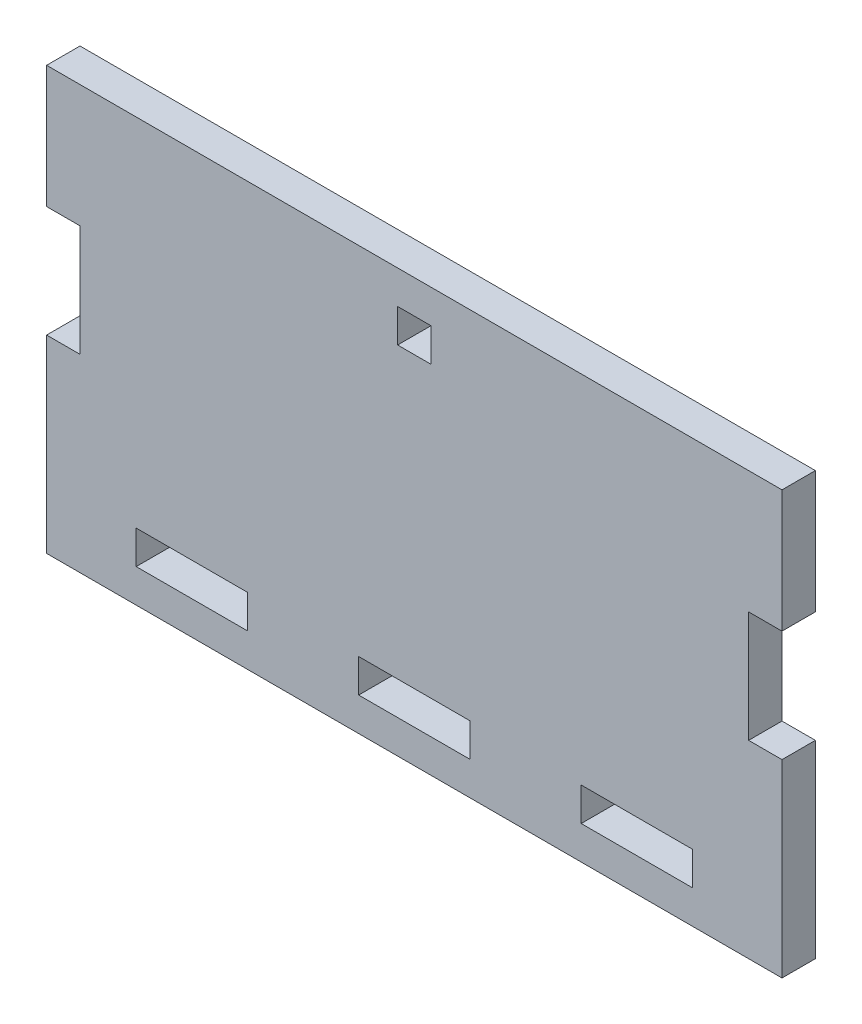
ISO-10303-21;
HEADER;
FILE_DESCRIPTION(('STEP AP214'),'2;1');
FILE_NAME('part.step','',(''),(''),'','','');
FILE_SCHEMA(('AUTOMOTIVE_DESIGN { 1 0 10303 214 1 1 1 1 }'));
ENDSEC;
DATA;
#1=APPLICATION_CONTEXT('core data for automotive mechanical design processes');
#2=APPLICATION_PROTOCOL_DEFINITION('international standard','automotive_design',2000,#1);
#3=PRODUCT_CONTEXT('',#1,'mechanical');
#4=PRODUCT('Part','Part','',(#3));
#5=PRODUCT_RELATED_PRODUCT_CATEGORY('part','',(#4));
#6=PRODUCT_DEFINITION_FORMATION('','',#4);
#7=PRODUCT_DEFINITION_CONTEXT('part definition',#1,'design');
#8=PRODUCT_DEFINITION('design','',#6,#7);
#9=PRODUCT_DEFINITION_SHAPE('','',#8);
#10=(LENGTH_UNIT() NAMED_UNIT(*) SI_UNIT(.MILLI.,.METRE.));
#11=(NAMED_UNIT(*) PLANE_ANGLE_UNIT() SI_UNIT($,.RADIAN.));
#12=(NAMED_UNIT(*) SI_UNIT($,.STERADIAN.) SOLID_ANGLE_UNIT());
#13=UNCERTAINTY_MEASURE_WITH_UNIT(LENGTH_MEASURE(1.E-05),#10,'distance_accuracy_value','');
#14=(GEOMETRIC_REPRESENTATION_CONTEXT(3) GLOBAL_UNCERTAINTY_ASSIGNED_CONTEXT((#13)) GLOBAL_UNIT_ASSIGNED_CONTEXT((#10,
#11,#12)) REPRESENTATION_CONTEXT('',''));
#15=CARTESIAN_POINT('',(0.,0.,0.));
#16=DIRECTION('',(0.,0.,1.));
#17=DIRECTION('',(1.,0.,0.));
#18=AXIS2_PLACEMENT_3D('',#15,#16,#17);
#19=CARTESIAN_POINT('',(-13.0561098857442,0.,3.));
#20=DIRECTION('',(1.,0.,0.));
#21=DIRECTION('',(0.,0.,-1.));
#22=AXIS2_PLACEMENT_3D('',#19,#20,#21);
#23=PLANE('',#22);
#24=DIRECTION('',(0.,-1.,0.));
#25=VECTOR('',#24,1.);
#26=CARTESIAN_POINT('',(-13.0561098857442,0.,0.));
#27=LINE('',#26,#25);
#28=CARTESIAN_POINT('',(-13.0561098857442,-7.19066330459412,0.));
#29=VERTEX_POINT('',#28);
#30=CARTESIAN_POINT('',(-13.0561098857442,-10.1906633045941,0.));
#31=VERTEX_POINT('',#30);
#32=EDGE_CURVE('E318',#29,#31,#27,.T.);
#33=ORIENTED_EDGE('',*,*,#32,.F.);
#34=DIRECTION('',(0.,0.,-1.));
#35=VECTOR('',#34,1.);
#36=CARTESIAN_POINT('',(-13.0561098857442,-7.19066330459412,3.));
#37=LINE('',#36,#35);
#38=CARTESIAN_POINT('',(-13.0561098857442,-7.19066330459412,3.));
#39=VERTEX_POINT('',#38);
#40=EDGE_CURVE('E11',#39,#29,#37,.T.);
#41=ORIENTED_EDGE('',*,*,#40,.F.);
#42=DIRECTION('',(0.,-1.,0.));
#43=VECTOR('',#42,1.);
#44=CARTESIAN_POINT('',(-13.0561098857442,0.,3.));
#45=LINE('',#44,#43);
#46=CARTESIAN_POINT('',(-13.0561098857442,-10.1906633045941,3.));
#47=VERTEX_POINT('',#46);
#48=EDGE_CURVE('E247',#39,#47,#45,.T.);
#49=ORIENTED_EDGE('',*,*,#48,.T.);
#50=DIRECTION('',(0.,0.,-1.));
#51=VECTOR('',#50,1.);
#52=CARTESIAN_POINT('',(-13.0561098857442,-10.1906633045941,3.));
#53=LINE('',#52,#51);
#54=EDGE_CURVE('E148',#47,#31,#53,.T.);
#55=ORIENTED_EDGE('',*,*,#54,.T.);
#56=EDGE_LOOP('',(#33,#41,#49,#55));
#57=FACE_BOUND('',#56,.T.);
#58=ADVANCED_FACE('F34',(#57),#23,.T.);
#59=CARTESIAN_POINT('',(0.,-7.19066330459412,3.));
#60=DIRECTION('',(0.,-1.,0.));
#61=DIRECTION('',(1.,0.,0.));
#62=AXIS2_PLACEMENT_3D('',#59,#60,#61);
#63=PLANE('',#62);
#64=DIRECTION('',(-1.,0.,0.));
#65=VECTOR('',#64,1.);
#66=CARTESIAN_POINT('',(0.,-7.19066330459412,0.));
#67=LINE('',#66,#65);
#68=CARTESIAN_POINT('',(-3.05610988574417,-7.19066330459412,0.));
#69=VERTEX_POINT('',#68);
#70=EDGE_CURVE('E237',#69,#29,#67,.T.);
#71=ORIENTED_EDGE('',*,*,#70,.F.);
#72=DIRECTION('',(0.,0.,-1.));
#73=VECTOR('',#72,1.);
#74=CARTESIAN_POINT('',(-3.05610988574417,-7.19066330459412,3.));
#75=LINE('',#74,#73);
#76=CARTESIAN_POINT('',(-3.05610988574417,-7.19066330459412,3.));
#77=VERTEX_POINT('',#76);
#78=EDGE_CURVE('E44',#77,#69,#75,.T.);
#79=ORIENTED_EDGE('',*,*,#78,.F.);
#80=DIRECTION('',(-1.,0.,0.));
#81=VECTOR('',#80,1.);
#82=CARTESIAN_POINT('',(0.,-7.19066330459412,3.));
#83=LINE('',#82,#81);
#84=EDGE_CURVE('E235',#77,#39,#83,.T.);
#85=ORIENTED_EDGE('',*,*,#84,.T.);
#86=ORIENTED_EDGE('',*,*,#40,.T.);
#87=EDGE_LOOP('',(#71,#79,#85,#86));
#88=FACE_BOUND('',#87,.T.);
#89=ADVANCED_FACE('F233',(#88),#63,.T.);
#90=CARTESIAN_POINT('',(-3.05610988574417,0.,3.));
#91=DIRECTION('',(1.,0.,0.));
#92=DIRECTION('',(0.,1.,0.));
#93=AXIS2_PLACEMENT_3D('',#90,#91,#92);
#94=PLANE('',#93);
#95=DIRECTION('',(0.,-1.,0.));
#96=VECTOR('',#95,1.);
#97=CARTESIAN_POINT('',(-3.05610988574417,0.,0.));
#98=LINE('',#97,#96);
#99=CARTESIAN_POINT('',(-3.05610988574417,-10.1906633045941,0.));
#100=VERTEX_POINT('',#99);
#101=EDGE_CURVE('E321',#69,#100,#98,.T.);
#102=ORIENTED_EDGE('',*,*,#101,.T.);
#103=DIRECTION('',(0.,0.,-1.));
#104=VECTOR('',#103,1.);
#105=CARTESIAN_POINT('',(-3.05610988574417,-10.1906633045941,3.));
#106=LINE('',#105,#104);
#107=CARTESIAN_POINT('',(-3.05610988574417,-10.1906633045941,3.));
#108=VERTEX_POINT('',#107);
#109=EDGE_CURVE('E240',#108,#100,#106,.T.);
#110=ORIENTED_EDGE('',*,*,#109,.F.);
#111=DIRECTION('',(0.,-1.,0.));
#112=VECTOR('',#111,1.);
#113=CARTESIAN_POINT('',(-3.05610988574417,0.,3.));
#114=LINE('',#113,#112);
#115=EDGE_CURVE('E243',#77,#108,#114,.T.);
#116=ORIENTED_EDGE('',*,*,#115,.F.);
#117=ORIENTED_EDGE('',*,*,#78,.T.);
#118=EDGE_LOOP('',(#102,#110,#116,#117));
#119=FACE_BOUND('',#118,.T.);
#120=ADVANCED_FACE('F244',(#119),#94,.F.);
#121=CARTESIAN_POINT('',(-53.0561098857442,-1.22716905817074E-13,3.));
#122=DIRECTION('',(1.,0.,0.));
#123=DIRECTION('',(0.,1.,0.));
#124=AXIS2_PLACEMENT_3D('',#121,#122,#123);
#125=PLANE('',#124);
#126=DIRECTION('',(0.,-1.,0.));
#127=VECTOR('',#126,1.);
#128=CARTESIAN_POINT('',(-53.0561098857442,-1.22716905817074E-13,0.));
#129=LINE('',#128,#127);
#130=CARTESIAN_POINT('',(-53.0561098857442,-7.1906633045941,0.));
#131=VERTEX_POINT('',#130);
#132=CARTESIAN_POINT('',(-53.0561098857442,-10.1906633045941,0.));
#133=VERTEX_POINT('',#132);
#134=EDGE_CURVE('E306',#131,#133,#129,.T.);
#135=ORIENTED_EDGE('',*,*,#134,.F.);
#136=DIRECTION('',(0.,0.,-1.));
#137=VECTOR('',#136,1.);
#138=CARTESIAN_POINT('',(-53.0561098857442,-7.1906633045941,3.));
#139=LINE('',#138,#137);
#140=CARTESIAN_POINT('',(-53.0561098857442,-7.1906633045941,3.));
#141=VERTEX_POINT('',#140);
#142=EDGE_CURVE('E326',#141,#131,#139,.T.);
#143=ORIENTED_EDGE('',*,*,#142,.F.);
#144=DIRECTION('',(0.,-1.,0.));
#145=VECTOR('',#144,1.);
#146=CARTESIAN_POINT('',(-53.0561098857442,-1.22716905817074E-13,3.));
#147=LINE('',#146,#145);
#148=CARTESIAN_POINT('',(-53.0561098857442,-10.1906633045941,3.));
#149=VERTEX_POINT('',#148);
#150=EDGE_CURVE('E720',#141,#149,#147,.T.);
#151=ORIENTED_EDGE('',*,*,#150,.T.);
#152=DIRECTION('',(0.,0.,-1.));
#153=VECTOR('',#152,1.);
#154=CARTESIAN_POINT('',(-53.0561098857442,-10.1906633045941,3.));
#155=LINE('',#154,#153);
#156=EDGE_CURVE('E328',#149,#133,#155,.T.);
#157=ORIENTED_EDGE('',*,*,#156,.T.);
#158=EDGE_LOOP('',(#135,#143,#151,#157));
#159=FACE_BOUND('',#158,.T.);
#160=ADVANCED_FACE('F423',(#159),#125,.T.);
#161=CARTESIAN_POINT('',(0.,-7.19066330459405,3.));
#162=DIRECTION('',(0.,1.,0.));
#163=DIRECTION('',(-1.,0.,0.));
#164=AXIS2_PLACEMENT_3D('',#161,#162,#163);
#165=PLANE('',#164);
#166=DIRECTION('',(1.,0.,0.));
#167=VECTOR('',#166,1.);
#168=CARTESIAN_POINT('',(0.,-7.19066330459405,0.));
#169=LINE('',#168,#167);
#170=CARTESIAN_POINT('',(-43.0561098857442,-7.19066330459409,0.));
#171=VERTEX_POINT('',#170);
#172=EDGE_CURVE('E309',#131,#171,#169,.T.);
#173=ORIENTED_EDGE('',*,*,#172,.T.);
#174=DIRECTION('',(0.,0.,-1.));
#175=VECTOR('',#174,1.);
#176=CARTESIAN_POINT('',(-43.0561098857442,-7.19066330459409,3.));
#177=LINE('',#176,#175);
#178=CARTESIAN_POINT('',(-43.0561098857442,-7.19066330459409,3.));
#179=VERTEX_POINT('',#178);
#180=EDGE_CURVE('E333',#179,#171,#177,.T.);
#181=ORIENTED_EDGE('',*,*,#180,.F.);
#182=DIRECTION('',(1.,0.,0.));
#183=VECTOR('',#182,1.);
#184=CARTESIAN_POINT('',(0.,-7.19066330459405,3.));
#185=LINE('',#184,#183);
#186=EDGE_CURVE('E723',#141,#179,#185,.T.);
#187=ORIENTED_EDGE('',*,*,#186,.F.);
#188=ORIENTED_EDGE('',*,*,#142,.T.);
#189=EDGE_LOOP('',(#173,#181,#187,#188));
#190=FACE_BOUND('',#189,.T.);
#191=ADVANCED_FACE('F419',(#190),#165,.F.);
#192=CARTESIAN_POINT('',(-43.0561098857442,0.,3.));
#193=DIRECTION('',(1.,0.,0.));
#194=DIRECTION('',(0.,0.,-1.));
#195=AXIS2_PLACEMENT_3D('',#192,#193,#194);
#196=PLANE('',#195);
#197=DIRECTION('',(0.,-1.,0.));
#198=VECTOR('',#197,1.);
#199=CARTESIAN_POINT('',(-43.0561098857442,0.,0.));
#200=LINE('',#199,#198);
#201=CARTESIAN_POINT('',(-43.0561098857442,-10.1906633045941,0.));
#202=VERTEX_POINT('',#201);
#203=EDGE_CURVE('E312',#171,#202,#200,.T.);
#204=ORIENTED_EDGE('',*,*,#203,.T.);
#205=DIRECTION('',(0.,0.,-1.));
#206=VECTOR('',#205,1.);
#207=CARTESIAN_POINT('',(-43.0561098857442,-10.1906633045941,3.));
#208=LINE('',#207,#206);
#209=CARTESIAN_POINT('',(-43.0561098857442,-10.1906633045941,3.));
#210=VERTEX_POINT('',#209);
#211=EDGE_CURVE('E330',#210,#202,#208,.T.);
#212=ORIENTED_EDGE('',*,*,#211,.F.);
#213=DIRECTION('',(0.,-1.,0.));
#214=VECTOR('',#213,1.);
#215=CARTESIAN_POINT('',(-43.0561098857442,0.,3.));
#216=LINE('',#215,#214);
#217=EDGE_CURVE('E726',#179,#210,#216,.T.);
#218=ORIENTED_EDGE('',*,*,#217,.F.);
#219=ORIENTED_EDGE('',*,*,#180,.T.);
#220=EDGE_LOOP('',(#204,#212,#218,#219));
#221=FACE_BOUND('',#220,.T.);
#222=ADVANCED_FACE('F415',(#221),#196,.F.);
#223=CARTESIAN_POINT('',(-23.0561098857442,0.,3.));
#224=DIRECTION('',(-1.,0.,0.));
#225=DIRECTION('',(0.,-1.,0.));
#226=AXIS2_PLACEMENT_3D('',#223,#224,#225);
#227=PLANE('',#226);
#228=DIRECTION('',(0.,1.,0.));
#229=VECTOR('',#228,1.);
#230=CARTESIAN_POINT('',(-23.0561098857442,0.,0.));
#231=LINE('',#230,#229);
#232=CARTESIAN_POINT('',(-23.0561098857442,-10.1906633045941,0.));
#233=VERTEX_POINT('',#232);
#234=CARTESIAN_POINT('',(-23.0561098857442,-7.19066330459408,0.));
#235=VERTEX_POINT('',#234);
#236=EDGE_CURVE('E294',#233,#235,#231,.T.);
#237=ORIENTED_EDGE('',*,*,#236,.F.);
#238=DIRECTION('',(0.,0.,-1.));
#239=VECTOR('',#238,1.);
#240=CARTESIAN_POINT('',(-23.0561098857442,-10.1906633045941,3.));
#241=LINE('',#240,#239);
#242=CARTESIAN_POINT('',(-23.0561098857442,-10.1906633045941,3.));
#243=VERTEX_POINT('',#242);
#244=EDGE_CURVE('E331',#243,#233,#241,.T.);
#245=ORIENTED_EDGE('',*,*,#244,.F.);
#246=DIRECTION('',(0.,1.,0.));
#247=VECTOR('',#246,1.);
#248=CARTESIAN_POINT('',(-23.0561098857442,0.,3.));
#249=LINE('',#248,#247);
#250=CARTESIAN_POINT('',(-23.0561098857442,-7.19066330459408,3.));
#251=VERTEX_POINT('',#250);
#252=EDGE_CURVE('E704',#243,#251,#249,.T.);
#253=ORIENTED_EDGE('',*,*,#252,.T.);
#254=DIRECTION('',(0.,0.,-1.));
#255=VECTOR('',#254,1.);
#256=CARTESIAN_POINT('',(-23.0561098857442,-7.19066330459408,3.));
#257=LINE('',#256,#255);
#258=EDGE_CURVE('E337',#251,#235,#257,.T.);
#259=ORIENTED_EDGE('',*,*,#258,.T.);
#260=EDGE_LOOP('',(#237,#245,#253,#259));
#261=FACE_BOUND('',#260,.T.);
#262=ADVANCED_FACE('F418',(#261),#227,.T.);
#263=CARTESIAN_POINT('',(0.,-10.1906633045942,3.));
#264=DIRECTION('',(0.,1.,0.));
#265=DIRECTION('',(-1.,0.,0.));
#266=AXIS2_PLACEMENT_3D('',#263,#264,#265);
#267=PLANE('',#266);
#268=DIRECTION('',(1.,0.,0.));
#269=VECTOR('',#268,1.);
#270=CARTESIAN_POINT('',(0.,-10.1906633045942,0.));
#271=LINE('',#270,#269);
#272=CARTESIAN_POINT('',(-33.0561098857442,-10.1906633045941,0.));
#273=VERTEX_POINT('',#272);
#274=EDGE_CURVE('E297',#273,#233,#271,.T.);
#275=ORIENTED_EDGE('',*,*,#274,.F.);
#276=DIRECTION('',(0.,0.,-1.));
#277=VECTOR('',#276,1.);
#278=CARTESIAN_POINT('',(-33.0561098857442,-10.1906633045941,3.));
#279=LINE('',#278,#277);
#280=CARTESIAN_POINT('',(-33.0561098857442,-10.1906633045941,3.));
#281=VERTEX_POINT('',#280);
#282=EDGE_CURVE('E342',#281,#273,#279,.T.);
#283=ORIENTED_EDGE('',*,*,#282,.F.);
#284=DIRECTION('',(1.,0.,0.));
#285=VECTOR('',#284,1.);
#286=CARTESIAN_POINT('',(0.,-10.1906633045942,3.));
#287=LINE('',#286,#285);
#288=EDGE_CURVE('E712',#281,#243,#287,.T.);
#289=ORIENTED_EDGE('',*,*,#288,.T.);
#290=ORIENTED_EDGE('',*,*,#244,.T.);
#291=EDGE_LOOP('',(#275,#283,#289,#290));
#292=FACE_BOUND('',#291,.T.);
#293=ADVANCED_FACE('F436',(#292),#267,.T.);
#294=CARTESIAN_POINT('',(-33.0561098857442,0.,3.));
#295=DIRECTION('',(-1.,0.,0.));
#296=DIRECTION('',(0.,-1.,0.));
#297=AXIS2_PLACEMENT_3D('',#294,#295,#296);
#298=PLANE('',#297);
#299=DIRECTION('',(0.,1.,0.));
#300=VECTOR('',#299,1.);
#301=CARTESIAN_POINT('',(-33.0561098857442,0.,0.));
#302=LINE('',#301,#300);
#303=CARTESIAN_POINT('',(-33.0561098857442,-7.19066330459406,0.));
#304=VERTEX_POINT('',#303);
#305=EDGE_CURVE('E300',#273,#304,#302,.T.);
#306=ORIENTED_EDGE('',*,*,#305,.T.);
#307=DIRECTION('',(0.,0.,-1.));
#308=VECTOR('',#307,1.);
#309=CARTESIAN_POINT('',(-33.0561098857442,-7.19066330459406,3.));
#310=LINE('',#309,#308);
#311=CARTESIAN_POINT('',(-33.0561098857442,-7.19066330459406,3.));
#312=VERTEX_POINT('',#311);
#313=EDGE_CURVE('E339',#312,#304,#310,.T.);
#314=ORIENTED_EDGE('',*,*,#313,.F.);
#315=DIRECTION('',(0.,1.,0.));
#316=VECTOR('',#315,1.);
#317=CARTESIAN_POINT('',(-33.0561098857442,0.,3.));
#318=LINE('',#317,#316);
#319=EDGE_CURVE('E715',#281,#312,#318,.T.);
#320=ORIENTED_EDGE('',*,*,#319,.F.);
#321=ORIENTED_EDGE('',*,*,#282,.T.);
#322=EDGE_LOOP('',(#306,#314,#320,#321));
#323=FACE_BOUND('',#322,.T.);
#324=ADVANCED_FACE('F432',(#323),#298,.F.);
#325=CARTESIAN_POINT('',(0.,-13.1906633045941,3.));
#326=DIRECTION('',(0.,1.,0.));
#327=DIRECTION('',(0.,0.,1.));
#328=AXIS2_PLACEMENT_3D('',#325,#326,#327);
#329=PLANE('',#328);
#330=DIRECTION('',(1.,0.,0.));
#331=VECTOR('',#330,1.);
#332=CARTESIAN_POINT('',(0.,-13.1906633045941,0.));
#333=LINE('',#332,#331);
#334=CARTESIAN_POINT('',(-61.1061098857442,-13.1906633045941,0.));
#335=VERTEX_POINT('',#334);
#336=CARTESIAN_POINT('',(4.99389011425583,-13.1906633045941,0.));
#337=VERTEX_POINT('',#336);
#338=EDGE_CURVE('E266',#335,#337,#333,.T.);
#339=ORIENTED_EDGE('',*,*,#338,.T.);
#340=DIRECTION('',(0.,0.,-1.));
#341=VECTOR('',#340,1.);
#342=CARTESIAN_POINT('',(4.99389011425583,-13.1906633045941,3.));
#343=LINE('',#342,#341);
#344=CARTESIAN_POINT('',(4.99389011425583,-13.1906633045941,3.));
#345=VERTEX_POINT('',#344);
#346=EDGE_CURVE('E340',#345,#337,#343,.T.);
#347=ORIENTED_EDGE('',*,*,#346,.F.);
#348=DIRECTION('',(1.,0.,0.));
#349=VECTOR('',#348,1.);
#350=CARTESIAN_POINT('',(0.,-13.1906633045941,3.));
#351=LINE('',#350,#349);
#352=CARTESIAN_POINT('',(-61.1061098857442,-13.1906633045941,3.));
#353=VERTEX_POINT('',#352);
#354=EDGE_CURVE('E765',#353,#345,#351,.T.);
#355=ORIENTED_EDGE('',*,*,#354,.F.);
#356=DIRECTION('',(0.,0.,-1.));
#357=VECTOR('',#356,1.);
#358=CARTESIAN_POINT('',(-61.1061098857442,-13.1906633045941,3.));
#359=LINE('',#358,#357);
#360=EDGE_CURVE('E345',#353,#335,#359,.T.);
#361=ORIENTED_EDGE('',*,*,#360,.T.);
#362=EDGE_LOOP('',(#339,#347,#355,#361));
#363=FACE_BOUND('',#362,.T.);
#364=ADVANCED_FACE('F435',(#363),#329,.F.);
#365=CARTESIAN_POINT('',(4.99389011425583,0.,3.));
#366=DIRECTION('',(1.,0.,0.));
#367=DIRECTION('',(0.,1.,0.));
#368=AXIS2_PLACEMENT_3D('',#365,#366,#367);
#369=PLANE('',#368);
#370=DIRECTION('',(0.,-1.,0.));
#371=VECTOR('',#370,1.);
#372=CARTESIAN_POINT('',(4.99389011425583,0.,0.));
#373=LINE('',#372,#371);
#374=CARTESIAN_POINT('',(4.99389011425583,3.8093366954059,0.));
#375=VERTEX_POINT('',#374);
#376=EDGE_CURVE('E269',#375,#337,#373,.T.);
#377=ORIENTED_EDGE('',*,*,#376,.F.);
#378=DIRECTION('',(0.,0.,-1.));
#379=VECTOR('',#378,1.);
#380=CARTESIAN_POINT('',(4.99389011425583,3.8093366954059,3.));
#381=LINE('',#380,#379);
#382=CARTESIAN_POINT('',(4.99389011425583,3.8093366954059,3.));
#383=VERTEX_POINT('',#382);
#384=EDGE_CURVE('E370',#383,#375,#381,.T.);
#385=ORIENTED_EDGE('',*,*,#384,.F.);
#386=DIRECTION('',(0.,-1.,0.));
#387=VECTOR('',#386,1.);
#388=CARTESIAN_POINT('',(4.99389011425583,0.,3.));
#389=LINE('',#388,#387);
#390=EDGE_CURVE('E762',#383,#345,#389,.T.);
#391=ORIENTED_EDGE('',*,*,#390,.T.);
#392=ORIENTED_EDGE('',*,*,#346,.T.);
#393=EDGE_LOOP('',(#377,#385,#391,#392));
#394=FACE_BOUND('',#393,.T.);
#395=ADVANCED_FACE('F469',(#394),#369,.T.);
#396=CARTESIAN_POINT('',(0.,3.8093366954059,3.));
#397=DIRECTION('',(0.,1.,0.));
#398=DIRECTION('',(0.,0.,1.));
#399=AXIS2_PLACEMENT_3D('',#396,#397,#398);
#400=PLANE('',#399);
#401=DIRECTION('',(1.,0.,0.));
#402=VECTOR('',#401,1.);
#403=CARTESIAN_POINT('',(0.,3.8093366954059,0.));
#404=LINE('',#403,#402);
#405=CARTESIAN_POINT('',(1.99389011425582,3.8093366954059,0.));
#406=VERTEX_POINT('',#405);
#407=EDGE_CURVE('E272',#406,#375,#404,.T.);
#408=ORIENTED_EDGE('',*,*,#407,.F.);
#409=DIRECTION('',(0.,0.,-1.));
#410=VECTOR('',#409,1.);
#411=CARTESIAN_POINT('',(1.99389011425582,3.8093366954059,3.));
#412=LINE('',#411,#410);
#413=CARTESIAN_POINT('',(1.99389011425582,3.8093366954059,3.));
#414=VERTEX_POINT('',#413);
#415=EDGE_CURVE('E368',#414,#406,#412,.T.);
#416=ORIENTED_EDGE('',*,*,#415,.F.);
#417=DIRECTION('',(1.,0.,0.));
#418=VECTOR('',#417,1.);
#419=CARTESIAN_POINT('',(0.,3.8093366954059,3.));
#420=LINE('',#419,#418);
#421=EDGE_CURVE('E759',#414,#383,#420,.T.);
#422=ORIENTED_EDGE('',*,*,#421,.T.);
#423=ORIENTED_EDGE('',*,*,#384,.T.);
#424=EDGE_LOOP('',(#408,#416,#422,#423));
#425=FACE_BOUND('',#424,.T.);
#426=ADVANCED_FACE('F476',(#425),#400,.T.);
#427=CARTESIAN_POINT('',(1.99389011425582,0.,3.));
#428=DIRECTION('',(1.,0.,0.));
#429=DIRECTION('',(0.,1.,0.));
#430=AXIS2_PLACEMENT_3D('',#427,#428,#429);
#431=PLANE('',#430);
#432=DIRECTION('',(0.,-1.,0.));
#433=VECTOR('',#432,1.);
#434=CARTESIAN_POINT('',(1.99389011425582,0.,0.));
#435=LINE('',#434,#433);
#436=CARTESIAN_POINT('',(1.99389011425582,13.8093366954059,0.));
#437=VERTEX_POINT('',#436);
#438=EDGE_CURVE('E276',#437,#406,#435,.T.);
#439=ORIENTED_EDGE('',*,*,#438,.F.);
#440=DIRECTION('',(0.,0.,-1.));
#441=VECTOR('',#440,1.);
#442=CARTESIAN_POINT('',(1.99389011425582,13.8093366954059,3.));
#443=LINE('',#442,#441);
#444=CARTESIAN_POINT('',(1.99389011425582,13.8093366954059,3.));
#445=VERTEX_POINT('',#444);
#446=EDGE_CURVE('E366',#445,#437,#443,.T.);
#447=ORIENTED_EDGE('',*,*,#446,.F.);
#448=DIRECTION('',(0.,-1.,0.));
#449=VECTOR('',#448,1.);
#450=CARTESIAN_POINT('',(1.99389011425582,0.,3.));
#451=LINE('',#450,#449);
#452=EDGE_CURVE('E756',#445,#414,#451,.T.);
#453=ORIENTED_EDGE('',*,*,#452,.T.);
#454=ORIENTED_EDGE('',*,*,#415,.T.);
#455=EDGE_LOOP('',(#439,#447,#453,#454));
#456=FACE_BOUND('',#455,.T.);
#457=ADVANCED_FACE('F472',(#456),#431,.T.);
#458=CARTESIAN_POINT('',(0.,13.8093366954059,3.));
#459=DIRECTION('',(0.,-1.,0.));
#460=DIRECTION('',(0.,0.,-1.));
#461=AXIS2_PLACEMENT_3D('',#458,#459,#460);
#462=PLANE('',#461);
#463=DIRECTION('',(-1.,0.,0.));
#464=VECTOR('',#463,1.);
#465=CARTESIAN_POINT('',(0.,13.8093366954059,0.));
#466=LINE('',#465,#464);
#467=CARTESIAN_POINT('',(4.99389011425582,13.8093366954059,0.));
#468=VERTEX_POINT('',#467);
#469=EDGE_CURVE('E279',#468,#437,#466,.T.);
#470=ORIENTED_EDGE('',*,*,#469,.F.);
#471=DIRECTION('',(0.,0.,-1.));
#472=VECTOR('',#471,1.);
#473=CARTESIAN_POINT('',(4.99389011425582,13.8093366954059,3.));
#474=LINE('',#473,#472);
#475=CARTESIAN_POINT('',(4.99389011425582,13.8093366954059,3.));
#476=VERTEX_POINT('',#475);
#477=EDGE_CURVE('E364',#476,#468,#474,.T.);
#478=ORIENTED_EDGE('',*,*,#477,.F.);
#479=DIRECTION('',(-1.,0.,0.));
#480=VECTOR('',#479,1.);
#481=CARTESIAN_POINT('',(0.,13.8093366954059,3.));
#482=LINE('',#481,#480);
#483=EDGE_CURVE('E753',#476,#445,#482,.T.);
#484=ORIENTED_EDGE('',*,*,#483,.T.);
#485=ORIENTED_EDGE('',*,*,#446,.T.);
#486=EDGE_LOOP('',(#470,#478,#484,#485));
#487=FACE_BOUND('',#486,.T.);
#488=ADVANCED_FACE('F467',(#487),#462,.T.);
#489=CARTESIAN_POINT('',(4.99389011425582,24.8093366954059,0.));
#490=VERTEX_POINT('',#489);
#491=EDGE_CURVE('E273',#490,#468,#373,.T.);
#492=ORIENTED_EDGE('',*,*,#491,.F.);
#493=DIRECTION('',(0.,0.,-1.));
#494=VECTOR('',#493,1.);
#495=CARTESIAN_POINT('',(4.99389011425582,24.8093366954059,3.));
#496=LINE('',#495,#494);
#497=CARTESIAN_POINT('',(4.99389011425582,24.8093366954059,3.));
#498=VERTEX_POINT('',#497);
#499=EDGE_CURVE('E362',#498,#490,#496,.T.);
#500=ORIENTED_EDGE('',*,*,#499,.F.);
#501=EDGE_CURVE('E752',#498,#476,#389,.T.);
#502=ORIENTED_EDGE('',*,*,#501,.T.);
#503=ORIENTED_EDGE('',*,*,#477,.T.);
#504=EDGE_LOOP('',(#492,#500,#502,#503));
#505=FACE_BOUND('',#504,.T.);
#506=ADVANCED_FACE('F463',(#505),#369,.T.);
#507=CARTESIAN_POINT('',(0.,24.8093366954059,3.));
#508=DIRECTION('',(0.,1.,0.));
#509=DIRECTION('',(-1.,0.,0.));
#510=AXIS2_PLACEMENT_3D('',#507,#508,#509);
#511=PLANE('',#510);
#512=DIRECTION('',(1.,0.,0.));
#513=VECTOR('',#512,1.);
#514=CARTESIAN_POINT('',(0.,24.8093366954059,0.));
#515=LINE('',#514,#513);
#516=CARTESIAN_POINT('',(-61.1061098857442,24.8093366954059,0.));
#517=VERTEX_POINT('',#516);
#518=EDGE_CURVE('E282',#517,#490,#515,.T.);
#519=ORIENTED_EDGE('',*,*,#518,.F.);
#520=DIRECTION('',(0.,0.,-1.));
#521=VECTOR('',#520,1.);
#522=CARTESIAN_POINT('',(-61.1061098857442,24.8093366954059,3.));
#523=LINE('',#522,#521);
#524=CARTESIAN_POINT('',(-61.1061098857442,24.8093366954059,3.));
#525=VERTEX_POINT('',#524);
#526=EDGE_CURVE('E360',#525,#517,#523,.T.);
#527=ORIENTED_EDGE('',*,*,#526,.F.);
#528=DIRECTION('',(1.,0.,0.));
#529=VECTOR('',#528,1.);
#530=CARTESIAN_POINT('',(0.,24.8093366954059,3.));
#531=LINE('',#530,#529);
#532=EDGE_CURVE('E749',#525,#498,#531,.T.);
#533=ORIENTED_EDGE('',*,*,#532,.T.);
#534=ORIENTED_EDGE('',*,*,#499,.T.);
#535=EDGE_LOOP('',(#519,#527,#533,#534));
#536=FACE_BOUND('',#535,.T.);
#537=ADVANCED_FACE('F460',(#536),#511,.T.);
#538=CARTESIAN_POINT('',(-61.1061098857442,0.,3.));
#539=DIRECTION('',(1.,0.,0.));
#540=DIRECTION('',(0.,1.,0.));
#541=AXIS2_PLACEMENT_3D('',#538,#539,#540);
#542=PLANE('',#541);
#543=DIRECTION('',(0.,-1.,0.));
#544=VECTOR('',#543,1.);
#545=CARTESIAN_POINT('',(-61.1061098857442,0.,0.));
#546=LINE('',#545,#544);
#547=CARTESIAN_POINT('',(-61.1061098857442,13.8093366954059,0.));
#548=VERTEX_POINT('',#547);
#549=EDGE_CURVE('E285',#517,#548,#546,.T.);
#550=ORIENTED_EDGE('',*,*,#549,.T.);
#551=DIRECTION('',(0.,0.,-1.));
#552=VECTOR('',#551,1.);
#553=CARTESIAN_POINT('',(-61.1061098857442,13.8093366954059,3.));
#554=LINE('',#553,#552);
#555=CARTESIAN_POINT('',(-61.1061098857442,13.8093366954059,3.));
#556=VERTEX_POINT('',#555);
#557=EDGE_CURVE('E357',#556,#548,#554,.T.);
#558=ORIENTED_EDGE('',*,*,#557,.F.);
#559=DIRECTION('',(0.,-1.,0.));
#560=VECTOR('',#559,1.);
#561=CARTESIAN_POINT('',(-61.1061098857442,0.,3.));
#562=LINE('',#561,#560);
#563=EDGE_CURVE('E706',#525,#556,#562,.T.);
#564=ORIENTED_EDGE('',*,*,#563,.F.);
#565=ORIENTED_EDGE('',*,*,#526,.T.);
#566=EDGE_LOOP('',(#550,#558,#564,#565));
#567=FACE_BOUND('',#566,.T.);
#568=ADVANCED_FACE('F447',(#567),#542,.F.);
#569=CARTESIAN_POINT('',(0.,13.8093366954059,3.));
#570=DIRECTION('',(0.,1.,0.));
#571=DIRECTION('',(0.,0.,1.));
#572=AXIS2_PLACEMENT_3D('',#569,#570,#571);
#573=PLANE('',#572);
#574=DIRECTION('',(1.,0.,0.));
#575=VECTOR('',#574,1.);
#576=CARTESIAN_POINT('',(0.,13.8093366954059,0.));
#577=LINE('',#576,#575);
#578=CARTESIAN_POINT('',(-58.1061098857442,13.8093366954059,0.));
#579=VERTEX_POINT('',#578);
#580=EDGE_CURVE('E287',#548,#579,#577,.T.);
#581=ORIENTED_EDGE('',*,*,#580,.T.);
#582=DIRECTION('',(0.,0.,-1.));
#583=VECTOR('',#582,1.);
#584=CARTESIAN_POINT('',(-58.1061098857442,13.8093366954059,3.));
#585=LINE('',#584,#583);
#586=CARTESIAN_POINT('',(-58.1061098857442,13.8093366954059,3.));
#587=VERTEX_POINT('',#586);
#588=EDGE_CURVE('E354',#587,#579,#585,.T.);
#589=ORIENTED_EDGE('',*,*,#588,.F.);
#590=DIRECTION('',(1.,0.,0.));
#591=VECTOR('',#590,1.);
#592=CARTESIAN_POINT('',(0.,13.8093366954059,3.));
#593=LINE('',#592,#591);
#594=EDGE_CURVE('E688',#556,#587,#593,.T.);
#595=ORIENTED_EDGE('',*,*,#594,.F.);
#596=ORIENTED_EDGE('',*,*,#557,.T.);
#597=EDGE_LOOP('',(#581,#589,#595,#596));
#598=FACE_BOUND('',#597,.T.);
#599=ADVANCED_FACE('F455',(#598),#573,.F.);
#600=CARTESIAN_POINT('',(-58.1061098857442,0.,3.));
#601=DIRECTION('',(1.,0.,0.));
#602=DIRECTION('',(0.,0.,-1.));
#603=AXIS2_PLACEMENT_3D('',#600,#601,#602);
#604=PLANE('',#603);
#605=DIRECTION('',(0.,-1.,0.));
#606=VECTOR('',#605,1.);
#607=CARTESIAN_POINT('',(-58.1061098857442,0.,0.));
#608=LINE('',#607,#606);
#609=CARTESIAN_POINT('',(-58.1061098857442,3.8093366954059,0.));
#610=VERTEX_POINT('',#609);
#611=EDGE_CURVE('E290',#579,#610,#608,.T.);
#612=ORIENTED_EDGE('',*,*,#611,.T.);
#613=DIRECTION('',(0.,0.,-1.));
#614=VECTOR('',#613,1.);
#615=CARTESIAN_POINT('',(-58.1061098857442,3.8093366954059,3.));
#616=LINE('',#615,#614);
#617=CARTESIAN_POINT('',(-58.1061098857442,3.8093366954059,3.));
#618=VERTEX_POINT('',#617);
#619=EDGE_CURVE('E351',#618,#610,#616,.T.);
#620=ORIENTED_EDGE('',*,*,#619,.F.);
#621=DIRECTION('',(0.,-1.,0.));
#622=VECTOR('',#621,1.);
#623=CARTESIAN_POINT('',(-58.1061098857442,0.,3.));
#624=LINE('',#623,#622);
#625=EDGE_CURVE('E702',#587,#618,#624,.T.);
#626=ORIENTED_EDGE('',*,*,#625,.F.);
#627=ORIENTED_EDGE('',*,*,#588,.T.);
#628=EDGE_LOOP('',(#612,#620,#626,#627));
#629=FACE_BOUND('',#628,.T.);
#630=ADVANCED_FACE('F451',(#629),#604,.F.);
#631=CARTESIAN_POINT('',(0.,3.8093366954059,3.));
#632=DIRECTION('',(0.,-1.,0.));
#633=DIRECTION('',(0.,0.,-1.));
#634=AXIS2_PLACEMENT_3D('',#631,#632,#633);
#635=PLANE('',#634);
#636=DIRECTION('',(-1.,0.,0.));
#637=VECTOR('',#636,1.);
#638=CARTESIAN_POINT('',(0.,3.8093366954059,0.));
#639=LINE('',#638,#637);
#640=CARTESIAN_POINT('',(-61.1061098857442,3.8093366954059,0.));
#641=VERTEX_POINT('',#640);
#642=EDGE_CURVE('E292',#610,#641,#639,.T.);
#643=ORIENTED_EDGE('',*,*,#642,.T.);
#644=DIRECTION('',(0.,0.,-1.));
#645=VECTOR('',#644,1.);
#646=CARTESIAN_POINT('',(-61.1061098857442,3.8093366954059,3.));
#647=LINE('',#646,#645);
#648=CARTESIAN_POINT('',(-61.1061098857442,3.8093366954059,3.));
#649=VERTEX_POINT('',#648);
#650=EDGE_CURVE('E348',#649,#641,#647,.T.);
#651=ORIENTED_EDGE('',*,*,#650,.F.);
#652=DIRECTION('',(-1.,0.,0.));
#653=VECTOR('',#652,1.);
#654=CARTESIAN_POINT('',(0.,3.8093366954059,3.));
#655=LINE('',#654,#653);
#656=EDGE_CURVE('E698',#618,#649,#655,.T.);
#657=ORIENTED_EDGE('',*,*,#656,.F.);
#658=ORIENTED_EDGE('',*,*,#619,.T.);
#659=EDGE_LOOP('',(#643,#651,#657,#658));
#660=FACE_BOUND('',#659,.T.);
#661=ADVANCED_FACE('F448',(#660),#635,.F.);
#662=CARTESIAN_POINT('',(0.,21.8093366954059,3.));
#663=DIRECTION('',(0.,1.,0.));
#664=DIRECTION('',(0.,0.,1.));
#665=AXIS2_PLACEMENT_3D('',#662,#663,#664);
#666=PLANE('',#665);
#667=DIRECTION('',(1.,0.,0.));
#668=VECTOR('',#667,1.);
#669=CARTESIAN_POINT('',(0.,21.8093366954059,0.));
#670=LINE('',#669,#668);
#671=CARTESIAN_POINT('',(-29.5561098857442,21.8093366954059,0.));
#672=VERTEX_POINT('',#671);
#673=CARTESIAN_POINT('',(-26.5561098857442,21.8093366954059,0.));
#674=VERTEX_POINT('',#673);
#675=EDGE_CURVE('E255',#672,#674,#670,.T.);
#676=ORIENTED_EDGE('',*,*,#675,.T.);
#677=DIRECTION('',(0.,0.,-1.));
#678=VECTOR('',#677,1.);
#679=CARTESIAN_POINT('',(-26.5561098857442,21.8093366954059,3.));
#680=LINE('',#679,#678);
#681=CARTESIAN_POINT('',(-26.5561098857442,21.8093366954059,3.));
#682=VERTEX_POINT('',#681);
#683=EDGE_CURVE('E38',#682,#674,#680,.T.);
#684=ORIENTED_EDGE('',*,*,#683,.F.);
#685=DIRECTION('',(1.,0.,0.));
#686=VECTOR('',#685,1.);
#687=CARTESIAN_POINT('',(0.,21.8093366954059,3.));
#688=LINE('',#687,#686);
#689=CARTESIAN_POINT('',(-29.5561098857442,21.8093366954059,3.));
#690=VERTEX_POINT('',#689);
#691=EDGE_CURVE('E324',#690,#682,#688,.T.);
#692=ORIENTED_EDGE('',*,*,#691,.F.);
#693=DIRECTION('',(0.,0.,-1.));
#694=VECTOR('',#693,1.);
#695=CARTESIAN_POINT('',(-29.5561098857442,21.8093366954059,3.));
#696=LINE('',#695,#694);
#697=EDGE_CURVE('E254',#690,#672,#696,.T.);
#698=ORIENTED_EDGE('',*,*,#697,.T.);
#699=EDGE_LOOP('',(#676,#684,#692,#698));
#700=FACE_BOUND('',#699,.T.);
#701=ADVANCED_FACE('F36',(#700),#666,.F.);
#702=CARTESIAN_POINT('',(-26.5561098857442,0.,3.));
#703=DIRECTION('',(1.,0.,0.));
#704=DIRECTION('',(0.,0.,-1.));
#705=AXIS2_PLACEMENT_3D('',#702,#703,#704);
#706=PLANE('',#705);
#707=DIRECTION('',(0.,-1.,0.));
#708=VECTOR('',#707,1.);
#709=CARTESIAN_POINT('',(-26.5561098857442,0.,0.));
#710=LINE('',#709,#708);
#711=CARTESIAN_POINT('',(-26.5561098857442,18.8093366954059,0.));
#712=VERTEX_POINT('',#711);
#713=EDGE_CURVE('E258',#674,#712,#710,.T.);
#714=ORIENTED_EDGE('',*,*,#713,.T.);
#715=DIRECTION('',(0.,0.,-1.));
#716=VECTOR('',#715,1.);
#717=CARTESIAN_POINT('',(-26.5561098857442,18.8093366954059,3.));
#718=LINE('',#717,#716);
#719=CARTESIAN_POINT('',(-26.5561098857442,18.8093366954059,3.));
#720=VERTEX_POINT('',#719);
#721=EDGE_CURVE('E375',#720,#712,#718,.T.);
#722=ORIENTED_EDGE('',*,*,#721,.F.);
#723=DIRECTION('',(0.,-1.,0.));
#724=VECTOR('',#723,1.);
#725=CARTESIAN_POINT('',(-26.5561098857442,0.,3.));
#726=LINE('',#725,#724);
#727=EDGE_CURVE('E156',#682,#720,#726,.T.);
#728=ORIENTED_EDGE('',*,*,#727,.F.);
#729=ORIENTED_EDGE('',*,*,#683,.T.);
#730=EDGE_LOOP('',(#714,#722,#728,#729));
#731=FACE_BOUND('',#730,.T.);
#732=ADVANCED_FACE('F381',(#731),#706,.F.);
#733=CARTESIAN_POINT('',(0.,18.8093366954059,3.));
#734=DIRECTION('',(0.,-1.,0.));
#735=DIRECTION('',(1.,0.,0.));
#736=AXIS2_PLACEMENT_3D('',#733,#734,#735);
#737=PLANE('',#736);
#738=DIRECTION('',(-1.,0.,0.));
#739=VECTOR('',#738,1.);
#740=CARTESIAN_POINT('',(0.,18.8093366954059,0.));
#741=LINE('',#740,#739);
#742=CARTESIAN_POINT('',(-29.5561098857442,18.8093366954059,0.));
#743=VERTEX_POINT('',#742);
#744=EDGE_CURVE('E260',#712,#743,#741,.T.);
#745=ORIENTED_EDGE('',*,*,#744,.T.);
#746=DIRECTION('',(0.,0.,-1.));
#747=VECTOR('',#746,1.);
#748=CARTESIAN_POINT('',(-29.5561098857442,18.8093366954059,3.));
#749=LINE('',#748,#747);
#750=CARTESIAN_POINT('',(-29.5561098857442,18.8093366954059,3.));
#751=VERTEX_POINT('',#750);
#752=EDGE_CURVE('E374',#751,#743,#749,.T.);
#753=ORIENTED_EDGE('',*,*,#752,.F.);
#754=DIRECTION('',(-1.,0.,0.));
#755=VECTOR('',#754,1.);
#756=CARTESIAN_POINT('',(0.,18.8093366954059,3.));
#757=LINE('',#756,#755);
#758=EDGE_CURVE('E768',#720,#751,#757,.T.);
#759=ORIENTED_EDGE('',*,*,#758,.F.);
#760=ORIENTED_EDGE('',*,*,#721,.T.);
#761=EDGE_LOOP('',(#745,#753,#759,#760));
#762=FACE_BOUND('',#761,.T.);
#763=ADVANCED_FACE('F395',(#762),#737,.F.);
#764=CARTESIAN_POINT('',(0.,-10.1906633045941,3.));
#765=DIRECTION('',(0.,1.,0.));
#766=DIRECTION('',(-1.,0.,0.));
#767=AXIS2_PLACEMENT_3D('',#764,#765,#766);
#768=PLANE('',#767);
#769=DIRECTION('',(1.,0.,0.));
#770=VECTOR('',#769,1.);
#771=CARTESIAN_POINT('',(0.,-10.1906633045941,0.));
#772=LINE('',#771,#770);
#773=EDGE_CURVE('E315',#133,#202,#772,.T.);
#774=ORIENTED_EDGE('',*,*,#773,.F.);
#775=ORIENTED_EDGE('',*,*,#156,.F.);
#776=DIRECTION('',(1.,0.,0.));
#777=VECTOR('',#776,1.);
#778=CARTESIAN_POINT('',(0.,-10.1906633045941,3.));
#779=LINE('',#778,#777);
#780=EDGE_CURVE('E249',#149,#210,#779,.T.);
#781=ORIENTED_EDGE('',*,*,#780,.T.);
#782=ORIENTED_EDGE('',*,*,#211,.T.);
#783=EDGE_LOOP('',(#774,#775,#781,#782));
#784=FACE_BOUND('',#783,.T.);
#785=ADVANCED_FACE('F397',(#784),#768,.T.);
#786=CARTESIAN_POINT('',(0.,-7.19066330459415,3.));
#787=DIRECTION('',(0.,-1.,0.));
#788=DIRECTION('',(1.,0.,0.));
#789=AXIS2_PLACEMENT_3D('',#786,#787,#788);
#790=PLANE('',#789);
#791=DIRECTION('',(-1.,0.,0.));
#792=VECTOR('',#791,1.);
#793=CARTESIAN_POINT('',(0.,-7.19066330459415,0.));
#794=LINE('',#793,#792);
#795=EDGE_CURVE('E303',#235,#304,#794,.T.);
#796=ORIENTED_EDGE('',*,*,#795,.F.);
#797=ORIENTED_EDGE('',*,*,#258,.F.);
#798=DIRECTION('',(-1.,0.,0.));
#799=VECTOR('',#798,1.);
#800=CARTESIAN_POINT('',(0.,-7.19066330459415,3.));
#801=LINE('',#800,#799);
#802=EDGE_CURVE('E717',#251,#312,#801,.T.);
#803=ORIENTED_EDGE('',*,*,#802,.T.);
#804=ORIENTED_EDGE('',*,*,#313,.T.);
#805=EDGE_LOOP('',(#796,#797,#803,#804));
#806=FACE_BOUND('',#805,.T.);
#807=ADVANCED_FACE('F403',(#806),#790,.T.);
#808=EDGE_CURVE('E288',#641,#335,#546,.T.);
#809=ORIENTED_EDGE('',*,*,#808,.T.);
#810=ORIENTED_EDGE('',*,*,#360,.F.);
#811=EDGE_CURVE('E701',#649,#353,#562,.T.);
#812=ORIENTED_EDGE('',*,*,#811,.F.);
#813=ORIENTED_EDGE('',*,*,#650,.T.);
#814=EDGE_LOOP('',(#809,#810,#812,#813));
#815=FACE_BOUND('',#814,.T.);
#816=ADVANCED_FACE('F430',(#815),#542,.F.);
#817=CARTESIAN_POINT('',(-29.5561098857442,0.,3.));
#818=DIRECTION('',(1.,0.,0.));
#819=DIRECTION('',(0.,0.,-1.));
#820=AXIS2_PLACEMENT_3D('',#817,#818,#819);
#821=PLANE('',#820);
#822=DIRECTION('',(0.,-1.,0.));
#823=VECTOR('',#822,1.);
#824=CARTESIAN_POINT('',(-29.5561098857442,0.,0.));
#825=LINE('',#824,#823);
#826=EDGE_CURVE('E263',#672,#743,#825,.T.);
#827=ORIENTED_EDGE('',*,*,#826,.F.);
#828=ORIENTED_EDGE('',*,*,#697,.F.);
#829=DIRECTION('',(0.,-1.,0.));
#830=VECTOR('',#829,1.);
#831=CARTESIAN_POINT('',(-29.5561098857442,0.,3.));
#832=LINE('',#831,#830);
#833=EDGE_CURVE('E394',#690,#751,#832,.T.);
#834=ORIENTED_EDGE('',*,*,#833,.T.);
#835=ORIENTED_EDGE('',*,*,#752,.T.);
#836=EDGE_LOOP('',(#827,#828,#834,#835));
#837=FACE_BOUND('',#836,.T.);
#838=ADVANCED_FACE('F390',(#837),#821,.T.);
#839=CARTESIAN_POINT('',(0.,-10.1906633045941,3.));
#840=DIRECTION('',(0.,-1.,0.));
#841=DIRECTION('',(1.,0.,0.));
#842=AXIS2_PLACEMENT_3D('',#839,#840,#841);
#843=PLANE('',#842);
#844=DIRECTION('',(-1.,0.,0.));
#845=VECTOR('',#844,1.);
#846=CARTESIAN_POINT('',(0.,-10.1906633045941,0.));
#847=LINE('',#846,#845);
#848=EDGE_CURVE('E141',#100,#31,#847,.T.);
#849=ORIENTED_EDGE('',*,*,#848,.T.);
#850=ORIENTED_EDGE('',*,*,#54,.F.);
#851=DIRECTION('',(-1.,0.,0.));
#852=VECTOR('',#851,1.);
#853=CARTESIAN_POINT('',(0.,-10.1906633045941,3.));
#854=LINE('',#853,#852);
#855=EDGE_CURVE('E53',#108,#47,#854,.T.);
#856=ORIENTED_EDGE('',*,*,#855,.F.);
#857=ORIENTED_EDGE('',*,*,#109,.T.);
#858=EDGE_LOOP('',(#849,#850,#856,#857));
#859=FACE_BOUND('',#858,.T.);
#860=ADVANCED_FACE('F484',(#859),#843,.F.);
#861=CARTESIAN_POINT('',(0.,0.,3.));
#862=DIRECTION('',(0.,0.,1.));
#863=DIRECTION('',(1.,0.,0.));
#864=AXIS2_PLACEMENT_3D('',#861,#862,#863);
#865=PLANE('',#864);
#866=ORIENTED_EDGE('',*,*,#691,.T.);
#867=ORIENTED_EDGE('',*,*,#727,.T.);
#868=ORIENTED_EDGE('',*,*,#758,.T.);
#869=ORIENTED_EDGE('',*,*,#833,.F.);
#870=EDGE_LOOP('',(#866,#867,#868,#869));
#871=FACE_BOUND('',#870,.T.);
#872=ORIENTED_EDGE('',*,*,#354,.T.);
#873=ORIENTED_EDGE('',*,*,#390,.F.);
#874=ORIENTED_EDGE('',*,*,#421,.F.);
#875=ORIENTED_EDGE('',*,*,#452,.F.);
#876=ORIENTED_EDGE('',*,*,#483,.F.);
#877=ORIENTED_EDGE('',*,*,#501,.F.);
#878=ORIENTED_EDGE('',*,*,#532,.F.);
#879=ORIENTED_EDGE('',*,*,#563,.T.);
#880=ORIENTED_EDGE('',*,*,#594,.T.);
#881=ORIENTED_EDGE('',*,*,#625,.T.);
#882=ORIENTED_EDGE('',*,*,#656,.T.);
#883=ORIENTED_EDGE('',*,*,#811,.T.);
#884=EDGE_LOOP('',(#872,#873,#874,#875,#876,#877,#878,#879,#880,#881,#882,#883));
#885=FACE_BOUND('',#884,.T.);
#886=ORIENTED_EDGE('',*,*,#252,.F.);
#887=ORIENTED_EDGE('',*,*,#288,.F.);
#888=ORIENTED_EDGE('',*,*,#319,.T.);
#889=ORIENTED_EDGE('',*,*,#802,.F.);
#890=EDGE_LOOP('',(#886,#887,#888,#889));
#891=FACE_BOUND('',#890,.T.);
#892=ORIENTED_EDGE('',*,*,#150,.F.);
#893=ORIENTED_EDGE('',*,*,#186,.T.);
#894=ORIENTED_EDGE('',*,*,#217,.T.);
#895=ORIENTED_EDGE('',*,*,#780,.F.);
#896=EDGE_LOOP('',(#892,#893,#894,#895));
#897=FACE_BOUND('',#896,.T.);
#898=ORIENTED_EDGE('',*,*,#48,.F.);
#899=ORIENTED_EDGE('',*,*,#84,.F.);
#900=ORIENTED_EDGE('',*,*,#115,.T.);
#901=ORIENTED_EDGE('',*,*,#855,.T.);
#902=EDGE_LOOP('',(#898,#899,#900,#901));
#903=FACE_BOUND('',#902,.T.);
#904=ADVANCED_FACE('F246',(#871,#885,#891,#897,#903),#865,.T.);
#905=CARTESIAN_POINT('',(0.,0.,0.));
#906=DIRECTION('',(0.,0.,1.));
#907=DIRECTION('',(1.,0.,0.));
#908=AXIS2_PLACEMENT_3D('',#905,#906,#907);
#909=PLANE('',#908);
#910=ORIENTED_EDGE('',*,*,#675,.F.);
#911=ORIENTED_EDGE('',*,*,#826,.T.);
#912=ORIENTED_EDGE('',*,*,#744,.F.);
#913=ORIENTED_EDGE('',*,*,#713,.F.);
#914=EDGE_LOOP('',(#910,#911,#912,#913));
#915=FACE_BOUND('',#914,.T.);
#916=ORIENTED_EDGE('',*,*,#338,.F.);
#917=ORIENTED_EDGE('',*,*,#808,.F.);
#918=ORIENTED_EDGE('',*,*,#642,.F.);
#919=ORIENTED_EDGE('',*,*,#611,.F.);
#920=ORIENTED_EDGE('',*,*,#580,.F.);
#921=ORIENTED_EDGE('',*,*,#549,.F.);
#922=ORIENTED_EDGE('',*,*,#518,.T.);
#923=ORIENTED_EDGE('',*,*,#491,.T.);
#924=ORIENTED_EDGE('',*,*,#469,.T.);
#925=ORIENTED_EDGE('',*,*,#438,.T.);
#926=ORIENTED_EDGE('',*,*,#407,.T.);
#927=ORIENTED_EDGE('',*,*,#376,.T.);
#928=EDGE_LOOP('',(#916,#917,#918,#919,#920,#921,#922,#923,#924,#925,#926,#927));
#929=FACE_BOUND('',#928,.T.);
#930=ORIENTED_EDGE('',*,*,#236,.T.);
#931=ORIENTED_EDGE('',*,*,#795,.T.);
#932=ORIENTED_EDGE('',*,*,#305,.F.);
#933=ORIENTED_EDGE('',*,*,#274,.T.);
#934=EDGE_LOOP('',(#930,#931,#932,#933));
#935=FACE_BOUND('',#934,.T.);
#936=ORIENTED_EDGE('',*,*,#134,.T.);
#937=ORIENTED_EDGE('',*,*,#773,.T.);
#938=ORIENTED_EDGE('',*,*,#203,.F.);
#939=ORIENTED_EDGE('',*,*,#172,.F.);
#940=EDGE_LOOP('',(#936,#937,#938,#939));
#941=FACE_BOUND('',#940,.T.);
#942=ORIENTED_EDGE('',*,*,#32,.T.);
#943=ORIENTED_EDGE('',*,*,#848,.F.);
#944=ORIENTED_EDGE('',*,*,#101,.F.);
#945=ORIENTED_EDGE('',*,*,#70,.T.);
#946=EDGE_LOOP('',(#942,#943,#944,#945));
#947=FACE_BOUND('',#946,.T.);
#948=ADVANCED_FACE('F387',(#915,#929,#935,#941,#947),#909,.F.);
#949=CLOSED_SHELL('',(#58,#89,#120,#160,#191,#222,#262,#293,#324,#364,#395,#426,#457,#488,#506,
#537,#568,#599,#630,#661,#701,#732,#763,#785,#807,#816,#838,#860,#904,#948));
#950=MANIFOLD_SOLID_BREP('B2',#949);
#951=ADVANCED_BREP_SHAPE_REPRESENTATION('',(#18,#950),#14);
#952=SHAPE_DEFINITION_REPRESENTATION(#9,#951);
ENDSEC;
END-ISO-10303-21;
